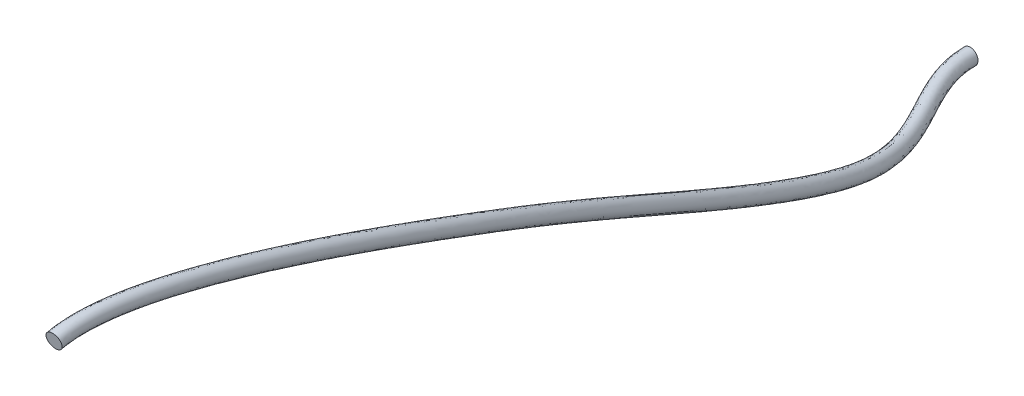
ISO-10303-21;
HEADER;
FILE_DESCRIPTION(('STEP AP214'),'2;1');
FILE_NAME('part.step','',(''),(''),'','','');
FILE_SCHEMA(('AUTOMOTIVE_DESIGN { 1 0 10303 214 1 1 1 1 }'));
ENDSEC;
DATA;
#1=APPLICATION_CONTEXT('core data for automotive mechanical design processes');
#2=APPLICATION_PROTOCOL_DEFINITION('international standard','automotive_design',2000,#1);
#3=PRODUCT_CONTEXT('',#1,'mechanical');
#4=PRODUCT('Part','Part','',(#3));
#5=PRODUCT_RELATED_PRODUCT_CATEGORY('part','',(#4));
#6=PRODUCT_DEFINITION_FORMATION('','',#4);
#7=PRODUCT_DEFINITION_CONTEXT('part definition',#1,'design');
#8=PRODUCT_DEFINITION('design','',#6,#7);
#9=PRODUCT_DEFINITION_SHAPE('','',#8);
#10=(LENGTH_UNIT() NAMED_UNIT(*) SI_UNIT(.MILLI.,.METRE.));
#11=(NAMED_UNIT(*) PLANE_ANGLE_UNIT() SI_UNIT($,.RADIAN.));
#12=(NAMED_UNIT(*) SI_UNIT($,.STERADIAN.) SOLID_ANGLE_UNIT());
#13=UNCERTAINTY_MEASURE_WITH_UNIT(LENGTH_MEASURE(1.E-05),#10,'distance_accuracy_value','');
#14=(GEOMETRIC_REPRESENTATION_CONTEXT(3) GLOBAL_UNCERTAINTY_ASSIGNED_CONTEXT((#13)) GLOBAL_UNIT_ASSIGNED_CONTEXT((#10,
#11,#12)) REPRESENTATION_CONTEXT('',''));
#15=CARTESIAN_POINT('',(0.,0.,0.));
#16=DIRECTION('',(0.,0.,1.));
#17=DIRECTION('',(1.,0.,0.));
#18=AXIS2_PLACEMENT_3D('',#15,#16,#17);
#19=CARTESIAN_POINT('',(0.,0.,0.));
#20=DIRECTION('',(0.,0.,1.));
#21=DIRECTION('',(1.,0.,0.));
#22=AXIS2_PLACEMENT_3D('',#19,#20,#21);
#23=PLANE('',#22);
#24=CARTESIAN_POINT('',(0.,0.,0.));
#25=DIRECTION('',(0.,0.,1.));
#26=DIRECTION('',(1.,0.,0.));
#27=AXIS2_PLACEMENT_3D('',#24,#25,#26);
#28=CIRCLE('',#27,1.15);
#29=CARTESIAN_POINT('',(1.15,0.,0.));
#30=VERTEX_POINT('',#29);
#31=EDGE_CURVE('E51',#30,#30,#28,.T.);
#32=ORIENTED_EDGE('',*,*,#31,.F.);
#33=EDGE_LOOP('',(#32));
#34=FACE_BOUND('',#33,.T.);
#35=ADVANCED_FACE('F44',(#34),#23,.F.);
#36=CARTESIAN_POINT('',(-0.886887072206888,30.1779143535164,133.772924009726));
#37=DIRECTION('',(0.0156976808539259,-0.218474366677383,0.97571642085225));
#38=DIRECTION('',(0.988964610147968,0.147168516549825,0.0170419368443332));
#39=AXIS2_PLACEMENT_3D('',#36,#37,#38);
#40=PLANE('',#39);
#41=CARTESIAN_POINT('',(-0.886887072206888,30.1779143535164,133.772924009726));
#42=DIRECTION('',(0.0156976808539259,-0.218474366677383,0.97571642085225));
#43=DIRECTION('',(0.988964610147968,0.147168516549825,0.0170419368443332));
#44=AXIS2_PLACEMENT_3D('',#41,#42,#43);
#45=CIRCLE('',#44,1.15);
#46=CARTESIAN_POINT('',(0.250422229463274,30.3471581475487,133.792522237097));
#47=VERTEX_POINT('',#46);
#48=EDGE_CURVE('E13',#47,#47,#45,.T.);
#49=ORIENTED_EDGE('',*,*,#48,.T.);
#50=EDGE_LOOP('',(#49));
#51=FACE_BOUND('',#50,.T.);
#52=ADVANCED_FACE('F58',(#51),#40,.T.);
#53=CARTESIAN_POINT('',(1.15,0.,0.));
#54=CARTESIAN_POINT('',(1.15000000318088,-2.32572517022418E-09,1.83045995616534));
#55=CARTESIAN_POINT('',(1.48540256643238,-0.131652962116543,3.39318425937632));
#56=CARTESIAN_POINT('',(2.57652434224196,-0.450105571981323,6.48661389034114));
#57=CARTESIAN_POINT('',(3.34013562057446,-0.639571659118326,8.01312758064647));
#58=CARTESIAN_POINT('',(5.01735778724815,-0.838009355414073,11.3933881363487));
#59=CARTESIAN_POINT('',(5.92805052690086,-0.844732145104019,13.2466804027271));
#60=CARTESIAN_POINT('',(7.53459054700162,-0.414846697415947,17.6239086879548));
#61=CARTESIAN_POINT('',(8.22783863495904,0.0220355357911086,20.146000416453));
#62=CARTESIAN_POINT('',(9.29632222791756,2.01710616140012,27.9385424278885));
#63=CARTESIAN_POINT('',(9.26159904662146,4.05057240486629,33.8855976991046));
#64=CARTESIAN_POINT('',(8.66842947236261,8.48252860136706,45.9889201829447));
#65=CARTESIAN_POINT('',(8.10435211191111,10.8813916355764,52.1363484312822));
#66=CARTESIAN_POINT('',(6.95461684017217,16.0476459114889,65.6818973040379));
#67=CARTESIAN_POINT('',(6.59479922473962,18.0359735209234,71.2850900011479));
#68=CARTESIAN_POINT('',(4.99787531807707,23.0335531970949,87.2654669867353));
#69=CARTESIAN_POINT('',(3.54250949783374,26.1577984222797,98.507203968944));
#70=CARTESIAN_POINT('',(1.72934199322773,29.3448378318201,113.988527694677));
#71=CARTESIAN_POINT('',(1.18664774081132,30.156884633241,118.918089920489));
#72=CARTESIAN_POINT('',(0.615926440086189,30.753392931423,125.363638080971));
#73=CARTESIAN_POINT('',(0.466253875924809,30.8485993187429,127.353980889404));
#74=CARTESIAN_POINT('',(0.272923330107723,30.7919707426224,130.915048748334));
#75=CARTESIAN_POINT('',(0.229400805332396,30.6397263582849,132.485899347241));
#76=CARTESIAN_POINT('',(0.250422229463274,30.3471581475487,133.792522237097));
#77=CARTESIAN_POINT('',(1.15,2.3,0.));
#78=CARTESIAN_POINT('',(1.15000000352708,2.29999999753905,1.94220695712433));
#79=CARTESIAN_POINT('',(1.51017027547733,2.15960633137279,3.59355408728274));
#80=CARTESIAN_POINT('',(2.61795347885941,1.83630139753476,6.73411632342694));
#81=CARTESIAN_POINT('',(3.36812343514886,1.65189172542171,8.22570028959878));
#82=CARTESIAN_POINT('',(4.97246765706074,1.46210075821228,11.4586051368223));
#83=CARTESIAN_POINT('',(5.82759688192571,1.45637036762804,13.1988672326933));
#84=CARTESIAN_POINT('',(7.34350156650568,1.86200097362939,17.3291214896496));
#85=CARTESIAN_POINT('',(8.00395304512263,2.27411201986334,19.7201819238093));
#86=CARTESIAN_POINT('',(9.03330172894394,4.19610997791983,27.2273095543784));
#87=CARTESIAN_POINT('',(9.00878848773641,6.20704042512217,33.1257937452365));
#88=CARTESIAN_POINT('',(8.41926286430756,10.6117806709234,45.1547911910304));
#89=CARTESIAN_POINT('',(7.85686147391015,13.0052566327089,51.288893748441));
#90=CARTESIAN_POINT('',(6.70391172186939,18.1859549522407,64.8723138693582));
#91=CARTESIAN_POINT('',(6.33927200287819,20.1971791438676,70.539674784754));
#92=CARTESIAN_POINT('',(4.7332652199508,25.2231837153326,86.6109438767537));
#93=CARTESIAN_POINT('',(3.27120018262199,28.3632105167751,97.9022243974107));
#94=CARTESIAN_POINT('',(1.43821424916261,31.5851013670495,113.552836505169));
#95=CARTESIAN_POINT('',(0.887019766148672,32.4115273879079,118.552746053079));
#96=CARTESIAN_POINT('',(0.299291574888187,33.0258122339404,125.190376344252));
#97=CARTESIAN_POINT('',(0.143108187483457,33.1266279390656,127.259518276785));
#98=CARTESIAN_POINT('',(-0.0624665727704346,33.0664126954611,131.046152259761));
#99=CARTESIAN_POINT('',(-0.113059009760775,32.9089938379432,132.762623147184));
#100=CARTESIAN_POINT('',(-0.0884090890917741,32.5659255765667,134.294781566025));
#101=CARTESIAN_POINT('',(-1.15,2.3,0.));
#102=CARTESIAN_POINT('',(-1.14999999679087,2.2999999976615,2.22834032237909));
#103=CARTESIAN_POINT('',(-0.724080313061559,2.13525701682363,4.17247749665823));
#104=CARTESIAN_POINT('',(0.512136700258389,1.7745042887606,7.67716336134527));
#105=CARTESIAN_POINT('',(1.30920693588446,1.58232900168309,9.24846417136956));
#106=CARTESIAN_POINT('',(2.90937997131049,1.39324324010427,12.472976826232));
#107=CARTESIAN_POINT('',(3.71927404710048,1.39148601666258,14.1260390603624));
#108=CARTESIAN_POINT('',(5.14088603948484,1.77189421420489,17.9993814120293));
#109=CARTESIAN_POINT('',(5.75747837260313,2.15426168403649,20.2244183685949));
#110=CARTESIAN_POINT('',(6.73287565256194,3.97552170283577,27.3380738203759));
#111=CARTESIAN_POINT('',(6.72230631244109,5.95487255541089,33.1678558074511));
#112=CARTESIAN_POINT('',(6.13810898363825,10.319801801359,45.0881285924903));
#113=CARTESIAN_POINT('',(5.57835391891612,12.7043002008032,51.1998866301678));
#114=CARTESIAN_POINT('',(4.42336803454024,17.894147737533,64.8072953416154));
#115=CARTESIAN_POINT('',(4.05985195147911,19.8979078873531,70.4560653783435));
#116=CARTESIAN_POINT('',(2.46428638149826,24.8912366413145,86.4228495182401));
#117=CARTESIAN_POINT('',(1.0042840309858,28.0297044973704,97.7025433539448));
#118=CARTESIAN_POINT('',(-0.829174945404349,31.2524332986553,113.357183490141));
#119=CARTESIAN_POINT('',(-1.38121771235819,32.0804912273543,118.363334510842));
#120=CARTESIAN_POINT('',(-1.97145581485722,32.697400268338,125.029309260332));
#121=CARTESIAN_POINT('',(-2.12871113403964,32.7991922183773,127.111144488415));
#122=CARTESIAN_POINT('',(-2.3364323942484,32.7383501145549,130.937311331838));
#123=CARTESIAN_POINT('',(-2.38837031352804,32.5801469941991,132.680370688568));
#124=CARTESIAN_POINT('',(-2.3630276924321,32.2274379885021,134.255585111283));
#125=CARTESIAN_POINT('',(-1.15,0.,0.));
#126=CARTESIAN_POINT('',(-1.14999999713708,-2.20326698119561E-09,2.1165933214201));
#127=CARTESIAN_POINT('',(-0.748848022106516,-0.156002276665706,3.97210766875181));
#128=CARTESIAN_POINT('',(0.470707563640932,-0.51190268075549,7.42966092825947));
#129=CARTESIAN_POINT('',(1.28121912130986,-0.709134382857151,9.03589146241725));
#130=CARTESIAN_POINT('',(2.95427010149811,-0.906866873521881,12.4077598257584));
#131=CARTESIAN_POINT('',(3.81972769207513,-0.909616496069475,14.1738522303972));
#132=CARTESIAN_POINT('',(5.33197501998127,-0.50495345684044,18.2941686103334));
#133=CARTESIAN_POINT('',(5.98136396243887,-0.09781480003574,20.6502368612386));
#134=CARTESIAN_POINT('',(6.99589615153661,1.79651788631607,28.049306693886));
#135=CARTESIAN_POINT('',(6.97511687132753,3.7984045351585,33.9276597613193));
#136=CARTESIAN_POINT('',(6.38727559169191,8.19054973179914,45.9222575844045));
#137=CARTESIAN_POINT('',(5.82584455691589,10.5804352036707,52.0473413130089));
#138=CARTESIAN_POINT('',(4.67407315284499,15.7558386967812,65.6168787762951));
#139=CARTESIAN_POINT('',(4.31537917334053,17.7367022644089,71.2014805947374));
#140=CARTESIAN_POINT('',(2.72889647962453,22.7016061230768,87.0773726282217));
#141=CARTESIAN_POINT('',(1.27559334619755,25.8242924028749,98.307522925478));
#142=CARTESIAN_POINT('',(-0.538047201339234,29.012169763426,113.792874679649));
#143=CARTESIAN_POINT('',(-1.08158973769519,29.8258484726873,118.728678378252));
#144=CARTESIAN_POINT('',(-1.65482094965939,30.4249809658207,125.202570997051));
#145=CARTESIAN_POINT('',(-1.80556544559829,30.5211635980563,127.205607101035));
#146=CARTESIAN_POINT('',(-2.00104249137024,30.4639081617146,130.80620782041));
#147=CARTESIAN_POINT('',(-2.04591049843453,30.310879514536,132.403646888624));
#148=CARTESIAN_POINT('',(-2.02419637387705,30.0086705594841,133.753325782355));
#149=CARTESIAN_POINT('',(-1.15,-2.3,0.));
#150=CARTESIAN_POINT('',(-1.14999999748328,-2.30000000206804,2.00484632046111));
#151=CARTESIAN_POINT('',(-0.773615731151474,-2.44726157015504,3.77173784084539));
#152=CARTESIAN_POINT('',(0.429278427023475,-2.79830965027158,7.18215849517367));
#153=CARTESIAN_POINT('',(1.25323130673525,-3.0005977673974,8.82331875346494));
#154=CARTESIAN_POINT('',(2.99916023168573,-3.20697698714803,12.3425428252847));
#155=CARTESIAN_POINT('',(3.92018133704978,-3.21071900880153,14.221665400432));
#156=CARTESIAN_POINT('',(5.5230640004777,-2.78180112788577,18.5889558086376));
#157=CARTESIAN_POINT('',(6.20524955227461,-2.34989128410797,21.0760553538822));
#158=CARTESIAN_POINT('',(7.25891665051128,-0.382485930203638,28.7605395673961));
#159=CARTESIAN_POINT('',(7.22792743021397,1.6419365149061,34.6874637151874));
#160=CARTESIAN_POINT('',(6.63644219974557,6.06129766223928,46.7563865763187));
#161=CARTESIAN_POINT('',(6.07333519491566,8.45657020653825,52.89479599585));
#162=CARTESIAN_POINT('',(4.92477827114973,13.6175296560294,66.4264622109749));
#163=CARTESIAN_POINT('',(4.57090639520196,15.5754966414647,71.9468958111314));
#164=CARTESIAN_POINT('',(2.9935065777508,20.5119756048391,87.7318957382034));
#165=CARTESIAN_POINT('',(1.54690266140929,23.6188803083795,98.9125024970113));
#166=CARTESIAN_POINT('',(-0.246919457274121,26.7719062281966,114.228565869157));
#167=CARTESIAN_POINT('',(-0.781961763032196,27.5712057180204,119.094022245663));
#168=CARTESIAN_POINT('',(-1.33818608446157,28.1525616633033,125.37583273377));
#169=CARTESIAN_POINT('',(-1.48241975715693,28.2431349777352,127.300069713654));
#170=CARTESIAN_POINT('',(-1.66565258849208,28.1894662088744,130.675104308983));
#171=CARTESIAN_POINT('',(-1.70345068334103,28.041612034873,132.126923088681));
#172=CARTESIAN_POINT('',(-1.685365055322,27.7899031304661,133.251066453428));
#173=CARTESIAN_POINT('',(1.15,-2.3,0.));
#174=CARTESIAN_POINT('',(1.15000000283468,-2.3000000021905,1.71871295520635));
#175=CARTESIAN_POINT('',(1.46063485738742,-2.42291225560588,3.1928144314699));
#176=CARTESIAN_POINT('',(2.5350952056245,-2.73651254149741,6.23911145725534));
#177=CARTESIAN_POINT('',(3.31214780600005,-2.93103504365836,7.80055487169416));
#178=CARTESIAN_POINT('',(5.06224791743557,-3.13811946904042,11.328171135875));
#179=CARTESIAN_POINT('',(6.02850417187601,-3.14583465783608,13.2944935727609));
#180=CARTESIAN_POINT('',(7.72567952749755,-2.69169436846128,17.91869588626));
#181=CARTESIAN_POINT('',(8.45172422479545,-2.23004094828112,20.5718189090966));
#182=CARTESIAN_POINT('',(9.55934272689118,-0.16189765511958,28.6497753013986));
#183=CARTESIAN_POINT('',(9.5144096055065,1.89410438461042,34.6454016529728));
#184=CARTESIAN_POINT('',(8.91759608041766,6.35327653181068,46.8230491748589));
#185=CARTESIAN_POINT('',(8.35184274991206,8.75752663844391,52.9838031141233));
#186=CARTESIAN_POINT('',(7.20532195847495,13.9093368707371,66.4914807387177));
#187=CARTESIAN_POINT('',(6.85032644660105,15.8747678979792,72.0305052175419));
#188=CARTESIAN_POINT('',(5.26248541620334,20.8439226788572,87.919990096717));
#189=CARTESIAN_POINT('',(3.81381881304549,23.9523863277843,99.1121835404772));
#190=CARTESIAN_POINT('',(2.02046973729284,27.1045742965908,114.424218884184));
#191=CARTESIAN_POINT('',(1.48627571547396,27.902241878574,119.283433787899));
#192=CARTESIAN_POINT('',(0.93256130528419,28.4809736289057,125.536899817689));
#193=CARTESIAN_POINT('',(0.789399564366161,28.5705706984203,127.448443502024));
#194=CARTESIAN_POINT('',(0.608313232985881,28.5175287897837,130.783945236906));
#195=CARTESIAN_POINT('',(0.571860620425567,28.3704588786266,132.209175547298));
#196=CARTESIAN_POINT('',(0.589253548018323,28.1283907185306,133.290262908169));
#197=CARTESIAN_POINT('',(1.15,0.,0.));
#198=CARTESIAN_POINT('',(1.15000000318088,-2.32572517022418E-09,1.83045995616534));
#199=CARTESIAN_POINT('',(1.48540256643238,-0.131652962116543,3.39318425937632));
#200=CARTESIAN_POINT('',(2.57652434224196,-0.450105571981323,6.48661389034114));
#201=CARTESIAN_POINT('',(3.34013562057446,-0.639571659118326,8.01312758064647));
#202=CARTESIAN_POINT('',(5.01735778724815,-0.838009355414073,11.3933881363487));
#203=CARTESIAN_POINT('',(5.92805052690086,-0.844732145104019,13.2466804027271));
#204=CARTESIAN_POINT('',(7.53459054700162,-0.414846697415947,17.6239086879548));
#205=CARTESIAN_POINT('',(8.22783863495904,0.0220355357911086,20.146000416453));
#206=CARTESIAN_POINT('',(9.29632222791756,2.01710616140012,27.9385424278885));
#207=CARTESIAN_POINT('',(9.26159904662146,4.05057240486629,33.8855976991046));
#208=CARTESIAN_POINT('',(8.66842947236261,8.48252860136706,45.9889201829447));
#209=CARTESIAN_POINT('',(8.10435211191111,10.8813916355764,52.1363484312822));
#210=CARTESIAN_POINT('',(6.95461684017217,16.0476459114889,65.6818973040379));
#211=CARTESIAN_POINT('',(6.59479922473962,18.0359735209234,71.2850900011479));
#212=CARTESIAN_POINT('',(4.99787531807707,23.0335531970949,87.2654669867353));
#213=CARTESIAN_POINT('',(3.54250949783374,26.1577984222797,98.507203968944));
#214=CARTESIAN_POINT('',(1.72934199322773,29.3448378318201,113.988527694677));
#215=CARTESIAN_POINT('',(1.18664774081132,30.156884633241,118.918089920489));
#216=CARTESIAN_POINT('',(0.615926440086189,30.753392931423,125.363638080971));
#217=CARTESIAN_POINT('',(0.466253875924809,30.8485993187429,127.353980889404));
#218=CARTESIAN_POINT('',(0.272923330107723,30.7919707426224,130.915048748334));
#219=CARTESIAN_POINT('',(0.229400805332396,30.6397263582849,132.485899347241));
#220=CARTESIAN_POINT('',(0.250422229463274,30.3471581475487,133.792522237097));
#221=(BOUNDED_SURFACE() B_SPLINE_SURFACE(3,3,((#53,#54,#55,#56,#57,#58,#59,#60,#61,#62,#63,#64,
#65,#66,#67,#68,#69,#70,#71,#72,#73,#74,#75,#76),(#77,#78,#79,#80,#81,#82,#83,#84,#85,#86,#87,
#88,#89,#90,#91,#92,#93,#94,#95,#96,#97,#98,#99,#100),(#101,#102,#103,#104,#105,#106,#107,#108,
#109,#110,#111,#112,#113,#114,#115,#116,#117,#118,#119,#120,#121,#122,#123,#124),(#125,#126,
#127,#128,#129,#130,#131,#132,#133,#134,#135,#136,#137,#138,#139,#140,#141,#142,#143,#144,#145,
#146,#147,#148),(#149,#150,#151,#152,#153,#154,#155,#156,#157,#158,#159,#160,#161,#162,#163,
#164,#165,#166,#167,#168,#169,#170,#171,#172),(#173,#174,#175,#176,#177,#178,#179,#180,#181,
#182,#183,#184,#185,#186,#187,#188,#189,#190,#191,#192,#193,#194,#195,#196),(#197,#198,#199,
#200,#201,#202,#203,#204,#205,#206,#207,#208,#209,#210,#211,#212,#213,#214,#215,#216,#217,#218,
#219,#220)),.UNSPECIFIED.,.T.,.F.,.F.) B_SPLINE_SURFACE_WITH_KNOTS((4,3,4),(4,2,2,2,2,2,2,2,2,2,
2,4),(0.,0.5,1.),(0.,0.0605175553157012,0.121035110631402,0.181552665947103,0.242070221262805,
0.337545074726631,0.433019928190457,0.591544001721485,0.795772000860743,0.897886000430371,
0.948943000215186,1.),
.UNSPECIFIED.) GEOMETRIC_REPRESENTATION_ITEM() RATIONAL_B_SPLINE_SURFACE(((1.,1.,1.,1.,1.,1.,1.,
1.,1.,1.,1.,1.,1.,1.,1.,1.,1.,1.,1.,1.,1.,1.,1.,1.),(0.333333333333333,0.333333333333333,
0.333333333333333,0.333333333333333,0.333333333333333,0.333333333333333,0.333333333333333,
0.333333333333333,0.333333333333333,0.333333333333333,0.333333333333333,0.333333333333333,
0.333333333333333,0.333333333333333,0.333333333333333,0.333333333333333,0.333333333333333,
0.333333333333333,0.333333333333333,0.333333333333333,0.333333333333333,0.333333333333333,
0.333333333333333,0.333333333333333),(0.333333333333333,0.333333333333333,0.333333333333333,
0.333333333333333,0.333333333333333,0.333333333333333,0.333333333333333,0.333333333333333,
0.333333333333333,0.333333333333333,0.333333333333333,0.333333333333333,0.333333333333333,
0.333333333333333,0.333333333333333,0.333333333333333,0.333333333333333,0.333333333333333,
0.333333333333333,0.333333333333333,0.333333333333333,0.333333333333333,0.333333333333333,
0.333333333333333),(1.,1.,1.,1.,1.,1.,1.,1.,1.,1.,1.,1.,1.,1.,1.,1.,1.,1.,1.,1.,1.,1.,1.,1.),
(0.333333333333333,0.333333333333333,0.333333333333333,0.333333333333333,0.333333333333333,
0.333333333333333,0.333333333333333,0.333333333333333,0.333333333333333,0.333333333333333,
0.333333333333333,0.333333333333333,0.333333333333333,0.333333333333333,0.333333333333333,
0.333333333333333,0.333333333333333,0.333333333333333,0.333333333333333,0.333333333333333,
0.333333333333333,0.333333333333333,0.333333333333333,0.333333333333333),(0.333333333333333,
0.333333333333333,0.333333333333333,0.333333333333333,0.333333333333333,0.333333333333333,
0.333333333333333,0.333333333333333,0.333333333333333,0.333333333333333,0.333333333333333,
0.333333333333333,0.333333333333333,0.333333333333333,0.333333333333333,0.333333333333333,
0.333333333333333,0.333333333333333,0.333333333333333,0.333333333333333,0.333333333333333,
0.333333333333333,0.333333333333333,0.333333333333333),(1.,1.,1.,1.,1.,1.,1.,1.,1.,1.,1.,1.,1.,
1.,1.,1.,1.,1.,1.,1.,1.,1.,1.,1.))) REPRESENTATION_ITEM('') SURFACE());
#222=ORIENTED_EDGE('',*,*,#48,.F.);
#223=EDGE_LOOP('',(#222));
#224=FACE_BOUND('',#223,.T.);
#225=ORIENTED_EDGE('',*,*,#31,.T.);
#226=EDGE_LOOP('',(#225));
#227=FACE_BOUND('',#226,.T.);
#228=ADVANCED_FACE('F60',(#224,#227),#221,.T.);
#229=CLOSED_SHELL('',(#35,#52,#228));
#230=MANIFOLD_SOLID_BREP('B2',#229);
#231=ADVANCED_BREP_SHAPE_REPRESENTATION('',(#18,#230),#14);
#232=SHAPE_DEFINITION_REPRESENTATION(#9,#231);
ENDSEC;
END-ISO-10303-21;
